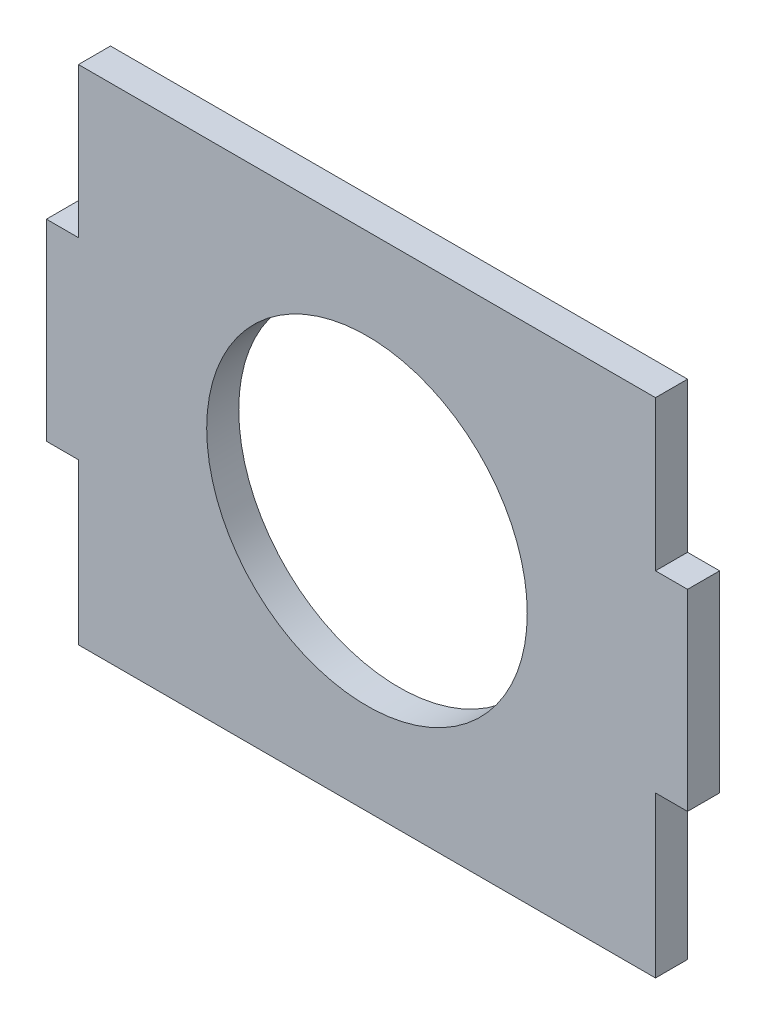
ISO-10303-21;
HEADER;
FILE_DESCRIPTION(('STEP AP214'),'2;1');
FILE_NAME('part.step','',(''),(''),'','','');
FILE_SCHEMA(('AUTOMOTIVE_DESIGN { 1 0 10303 214 1 1 1 1 }'));
ENDSEC;
DATA;
#1=APPLICATION_CONTEXT('core data for automotive mechanical design processes');
#2=APPLICATION_PROTOCOL_DEFINITION('international standard','automotive_design',2000,#1);
#3=PRODUCT_CONTEXT('',#1,'mechanical');
#4=PRODUCT('Part','Part','',(#3));
#5=PRODUCT_RELATED_PRODUCT_CATEGORY('part','',(#4));
#6=PRODUCT_DEFINITION_FORMATION('','',#4);
#7=PRODUCT_DEFINITION_CONTEXT('part definition',#1,'design');
#8=PRODUCT_DEFINITION('design','',#6,#7);
#9=PRODUCT_DEFINITION_SHAPE('','',#8);
#10=(LENGTH_UNIT() NAMED_UNIT(*) SI_UNIT(.MILLI.,.METRE.));
#11=(NAMED_UNIT(*) PLANE_ANGLE_UNIT() SI_UNIT($,.RADIAN.));
#12=(NAMED_UNIT(*) SI_UNIT($,.STERADIAN.) SOLID_ANGLE_UNIT());
#13=UNCERTAINTY_MEASURE_WITH_UNIT(LENGTH_MEASURE(1.E-05),#10,'distance_accuracy_value','');
#14=(GEOMETRIC_REPRESENTATION_CONTEXT(3) GLOBAL_UNCERTAINTY_ASSIGNED_CONTEXT((#13)) GLOBAL_UNIT_ASSIGNED_CONTEXT((#10,
#11,#12)) REPRESENTATION_CONTEXT('',''));
#15=CARTESIAN_POINT('',(0.,0.,0.));
#16=DIRECTION('',(0.,0.,1.));
#17=DIRECTION('',(1.,0.,0.));
#18=AXIS2_PLACEMENT_3D('',#15,#16,#17);
#19=CARTESIAN_POINT('',(0.,0.,3.175));
#20=DIRECTION('',(0.,0.,1.));
#21=DIRECTION('',(1.,0.,0.));
#22=AXIS2_PLACEMENT_3D('',#19,#20,#21);
#23=PLANE('',#22);
#24=DIRECTION('',(0.,-1.,0.));
#25=VECTOR('',#24,1.);
#26=CARTESIAN_POINT('',(-60.325,41.275,3.175));
#27=LINE('',#26,#25);
#28=CARTESIAN_POINT('',(-60.325,56.1264598778702,3.175));
#29=VERTEX_POINT('',#28);
#30=CARTESIAN_POINT('',(-60.325,41.275,3.175));
#31=VERTEX_POINT('',#30);
#32=EDGE_CURVE('E177',#29,#31,#27,.T.);
#33=ORIENTED_EDGE('',*,*,#32,.T.);
#34=DIRECTION('',(-1.,0.,0.));
#35=VECTOR('',#34,1.);
#36=CARTESIAN_POINT('',(-60.325,41.275,3.175));
#37=LINE('',#36,#35);
#38=CARTESIAN_POINT('',(-63.5,41.275,3.175));
#39=VERTEX_POINT('',#38);
#40=EDGE_CURVE('E105',#31,#39,#37,.T.);
#41=ORIENTED_EDGE('',*,*,#40,.T.);
#42=DIRECTION('',(0.,-1.,0.));
#43=VECTOR('',#42,1.);
#44=CARTESIAN_POINT('',(-63.5,41.275,3.175));
#45=LINE('',#44,#43);
#46=CARTESIAN_POINT('',(-63.5,22.225,3.175));
#47=VERTEX_POINT('',#46);
#48=EDGE_CURVE('E204',#39,#47,#45,.T.);
#49=ORIENTED_EDGE('',*,*,#48,.T.);
#50=DIRECTION('',(1.,0.,0.));
#51=VECTOR('',#50,1.);
#52=CARTESIAN_POINT('',(-63.5,22.225,3.175));
#53=LINE('',#52,#51);
#54=CARTESIAN_POINT('',(-60.325,22.225,3.175));
#55=VERTEX_POINT('',#54);
#56=EDGE_CURVE('E223',#47,#55,#53,.T.);
#57=ORIENTED_EDGE('',*,*,#56,.T.);
#58=DIRECTION('',(0.,-1.,0.));
#59=VECTOR('',#58,1.);
#60=CARTESIAN_POINT('',(-60.325,6.35000000000004,3.175));
#61=LINE('',#60,#59);
#62=CARTESIAN_POINT('',(-60.325,6.35000000000004,3.175));
#63=VERTEX_POINT('',#62);
#64=EDGE_CURVE('E220',#55,#63,#61,.T.);
#65=ORIENTED_EDGE('',*,*,#64,.T.);
#66=DIRECTION('',(1.,0.,0.));
#67=VECTOR('',#66,1.);
#68=CARTESIAN_POINT('',(-3.175,6.35000000000004,3.175));
#69=LINE('',#68,#67);
#70=CARTESIAN_POINT('',(-3.175,6.35000000000004,3.175));
#71=VERTEX_POINT('',#70);
#72=EDGE_CURVE('E222',#63,#71,#69,.T.);
#73=ORIENTED_EDGE('',*,*,#72,.T.);
#74=DIRECTION('',(0.,1.,0.));
#75=VECTOR('',#74,1.);
#76=CARTESIAN_POINT('',(-3.175,22.225,3.175));
#77=LINE('',#76,#75);
#78=CARTESIAN_POINT('',(-3.175,22.225,3.175));
#79=VERTEX_POINT('',#78);
#80=EDGE_CURVE('E225',#71,#79,#77,.T.);
#81=ORIENTED_EDGE('',*,*,#80,.T.);
#82=DIRECTION('',(1.,0.,0.));
#83=VECTOR('',#82,1.);
#84=CARTESIAN_POINT('',(-3.175,22.225,3.175));
#85=LINE('',#84,#83);
#86=CARTESIAN_POINT('',(0.,22.225,3.175));
#87=VERTEX_POINT('',#86);
#88=EDGE_CURVE('E231',#79,#87,#85,.T.);
#89=ORIENTED_EDGE('',*,*,#88,.T.);
#90=DIRECTION('',(0.,1.,0.));
#91=VECTOR('',#90,1.);
#92=CARTESIAN_POINT('',(0.,41.275,3.175));
#93=LINE('',#92,#91);
#94=CARTESIAN_POINT('',(0.,41.275,3.175));
#95=VERTEX_POINT('',#94);
#96=EDGE_CURVE('E136',#87,#95,#93,.T.);
#97=ORIENTED_EDGE('',*,*,#96,.T.);
#98=DIRECTION('',(-1.,0.,0.));
#99=VECTOR('',#98,1.);
#100=CARTESIAN_POINT('',(-3.175,41.275,3.175));
#101=LINE('',#100,#99);
#102=CARTESIAN_POINT('',(-3.175,41.275,3.175));
#103=VERTEX_POINT('',#102);
#104=EDGE_CURVE('E130',#95,#103,#101,.T.);
#105=ORIENTED_EDGE('',*,*,#104,.T.);
#106=DIRECTION('',(0.,1.,0.));
#107=VECTOR('',#106,1.);
#108=CARTESIAN_POINT('',(-3.175,41.275,3.175));
#109=LINE('',#108,#107);
#110=CARTESIAN_POINT('',(-3.175,56.1264598778702,3.175));
#111=VERTEX_POINT('',#110);
#112=EDGE_CURVE('E134',#103,#111,#109,.T.);
#113=ORIENTED_EDGE('',*,*,#112,.T.);
#114=DIRECTION('',(-1.,0.,0.));
#115=VECTOR('',#114,1.);
#116=CARTESIAN_POINT('',(-3.175,56.1264598778702,3.175));
#117=LINE('',#116,#115);
#118=EDGE_CURVE('E50',#111,#29,#117,.T.);
#119=ORIENTED_EDGE('',*,*,#118,.T.);
#120=EDGE_LOOP('',(#33,#41,#49,#57,#65,#73,#81,#89,#97,#105,#113,#119));
#121=FACE_BOUND('',#120,.T.);
#122=CARTESIAN_POINT('',(-31.75,31.27375,3.175));
#123=DIRECTION('',(0.,0.,1.));
#124=DIRECTION('',(1.,0.,0.));
#125=AXIS2_PLACEMENT_3D('',#122,#123,#124);
#126=CIRCLE('',#125,15.875);
#127=CARTESIAN_POINT('',(-15.875,31.27375,3.175));
#128=VERTEX_POINT('',#127);
#129=EDGE_CURVE('E158',#128,#128,#126,.T.);
#130=ORIENTED_EDGE('',*,*,#129,.F.);
#131=EDGE_LOOP('',(#130));
#132=FACE_BOUND('',#131,.T.);
#133=ADVANCED_FACE('F33',(#121,#132),#23,.T.);
#134=CARTESIAN_POINT('',(0.,0.,0.));
#135=DIRECTION('',(0.,0.,1.));
#136=DIRECTION('',(1.,0.,0.));
#137=AXIS2_PLACEMENT_3D('',#134,#135,#136);
#138=PLANE('',#137);
#139=DIRECTION('',(0.,-1.,0.));
#140=VECTOR('',#139,1.);
#141=CARTESIAN_POINT('',(-60.325,41.275,0.));
#142=LINE('',#141,#140);
#143=CARTESIAN_POINT('',(-60.325,56.1264598778702,0.));
#144=VERTEX_POINT('',#143);
#145=CARTESIAN_POINT('',(-60.325,41.275,0.));
#146=VERTEX_POINT('',#145);
#147=EDGE_CURVE('E154',#144,#146,#142,.T.);
#148=ORIENTED_EDGE('',*,*,#147,.F.);
#149=DIRECTION('',(-1.,0.,0.));
#150=VECTOR('',#149,1.);
#151=CARTESIAN_POINT('',(-3.175,56.1264598778702,0.));
#152=LINE('',#151,#150);
#153=CARTESIAN_POINT('',(-3.175,56.1264598778702,0.));
#154=VERTEX_POINT('',#153);
#155=EDGE_CURVE('E97',#154,#144,#152,.T.);
#156=ORIENTED_EDGE('',*,*,#155,.F.);
#157=DIRECTION('',(0.,1.,0.));
#158=VECTOR('',#157,1.);
#159=CARTESIAN_POINT('',(-3.175,41.275,0.));
#160=LINE('',#159,#158);
#161=CARTESIAN_POINT('',(-3.175,41.275,0.));
#162=VERTEX_POINT('',#161);
#163=EDGE_CURVE('E91',#162,#154,#160,.T.);
#164=ORIENTED_EDGE('',*,*,#163,.F.);
#165=DIRECTION('',(-1.,0.,0.));
#166=VECTOR('',#165,1.);
#167=CARTESIAN_POINT('',(-3.175,41.275,0.));
#168=LINE('',#167,#166);
#169=CARTESIAN_POINT('',(0.,41.275,0.));
#170=VERTEX_POINT('',#169);
#171=EDGE_CURVE('E144',#170,#162,#168,.T.);
#172=ORIENTED_EDGE('',*,*,#171,.F.);
#173=DIRECTION('',(0.,1.,0.));
#174=VECTOR('',#173,1.);
#175=CARTESIAN_POINT('',(0.,41.275,0.));
#176=LINE('',#175,#174);
#177=CARTESIAN_POINT('',(0.,22.225,0.));
#178=VERTEX_POINT('',#177);
#179=EDGE_CURVE('E172',#178,#170,#176,.T.);
#180=ORIENTED_EDGE('',*,*,#179,.F.);
#181=DIRECTION('',(1.,0.,0.));
#182=VECTOR('',#181,1.);
#183=CARTESIAN_POINT('',(-3.175,22.225,0.));
#184=LINE('',#183,#182);
#185=CARTESIAN_POINT('',(-3.175,22.225,0.));
#186=VERTEX_POINT('',#185);
#187=EDGE_CURVE('E170',#186,#178,#184,.T.);
#188=ORIENTED_EDGE('',*,*,#187,.F.);
#189=DIRECTION('',(0.,1.,0.));
#190=VECTOR('',#189,1.);
#191=CARTESIAN_POINT('',(-3.175,22.225,0.));
#192=LINE('',#191,#190);
#193=CARTESIAN_POINT('',(-3.175,6.35000000000004,0.));
#194=VERTEX_POINT('',#193);
#195=EDGE_CURVE('E168',#194,#186,#192,.T.);
#196=ORIENTED_EDGE('',*,*,#195,.F.);
#197=DIRECTION('',(1.,0.,0.));
#198=VECTOR('',#197,1.);
#199=CARTESIAN_POINT('',(-3.175,6.35000000000004,0.));
#200=LINE('',#199,#198);
#201=CARTESIAN_POINT('',(-60.325,6.35000000000004,0.));
#202=VERTEX_POINT('',#201);
#203=EDGE_CURVE('E166',#202,#194,#200,.T.);
#204=ORIENTED_EDGE('',*,*,#203,.F.);
#205=DIRECTION('',(0.,-1.,0.));
#206=VECTOR('',#205,1.);
#207=CARTESIAN_POINT('',(-60.325,6.35000000000004,0.));
#208=LINE('',#207,#206);
#209=CARTESIAN_POINT('',(-60.325,22.225,0.));
#210=VERTEX_POINT('',#209);
#211=EDGE_CURVE('E164',#210,#202,#208,.T.);
#212=ORIENTED_EDGE('',*,*,#211,.F.);
#213=DIRECTION('',(1.,0.,0.));
#214=VECTOR('',#213,1.);
#215=CARTESIAN_POINT('',(-63.5,22.225,0.));
#216=LINE('',#215,#214);
#217=CARTESIAN_POINT('',(-63.5,22.225,0.));
#218=VERTEX_POINT('',#217);
#219=EDGE_CURVE('E162',#218,#210,#216,.T.);
#220=ORIENTED_EDGE('',*,*,#219,.F.);
#221=DIRECTION('',(0.,-1.,0.));
#222=VECTOR('',#221,1.);
#223=CARTESIAN_POINT('',(-63.5,41.275,0.));
#224=LINE('',#223,#222);
#225=CARTESIAN_POINT('',(-63.5,41.275,0.));
#226=VERTEX_POINT('',#225);
#227=EDGE_CURVE('E160',#226,#218,#224,.T.);
#228=ORIENTED_EDGE('',*,*,#227,.F.);
#229=DIRECTION('',(-1.,0.,0.));
#230=VECTOR('',#229,1.);
#231=CARTESIAN_POINT('',(-60.325,41.275,0.));
#232=LINE('',#231,#230);
#233=EDGE_CURVE('E157',#146,#226,#232,.T.);
#234=ORIENTED_EDGE('',*,*,#233,.F.);
#235=EDGE_LOOP('',(#148,#156,#164,#172,#180,#188,#196,#204,#212,#220,#228,#234));
#236=FACE_BOUND('',#235,.T.);
#237=CARTESIAN_POINT('',(-31.75,31.27375,0.));
#238=DIRECTION('',(0.,0.,1.));
#239=DIRECTION('',(1.,0.,0.));
#240=AXIS2_PLACEMENT_3D('',#237,#238,#239);
#241=CIRCLE('',#240,15.875);
#242=CARTESIAN_POINT('',(-15.875,31.27375,0.));
#243=VERTEX_POINT('',#242);
#244=EDGE_CURVE('E378',#243,#243,#241,.T.);
#245=ORIENTED_EDGE('',*,*,#244,.T.);
#246=EDGE_LOOP('',(#245));
#247=FACE_BOUND('',#246,.T.);
#248=ADVANCED_FACE('F208',(#236,#247),#138,.F.);
#249=CARTESIAN_POINT('',(-60.325,41.275,3.175));
#250=DIRECTION('',(1.,0.,0.));
#251=DIRECTION('',(0.,0.,-1.));
#252=AXIS2_PLACEMENT_3D('',#249,#250,#251);
#253=PLANE('',#252);
#254=ORIENTED_EDGE('',*,*,#147,.T.);
#255=DIRECTION('',(0.,0.,-1.));
#256=VECTOR('',#255,1.);
#257=CARTESIAN_POINT('',(-60.325,41.275,3.175));
#258=LINE('',#257,#256);
#259=EDGE_CURVE('E11',#31,#146,#258,.T.);
#260=ORIENTED_EDGE('',*,*,#259,.F.);
#261=ORIENTED_EDGE('',*,*,#32,.F.);
#262=DIRECTION('',(0.,0.,-1.));
#263=VECTOR('',#262,1.);
#264=CARTESIAN_POINT('',(-60.325,56.1264598778702,3.175));
#265=LINE('',#264,#263);
#266=EDGE_CURVE('E150',#29,#144,#265,.T.);
#267=ORIENTED_EDGE('',*,*,#266,.T.);
#268=EDGE_LOOP('',(#254,#260,#261,#267));
#269=FACE_BOUND('',#268,.T.);
#270=ADVANCED_FACE('F35',(#269),#253,.F.);
#271=CARTESIAN_POINT('',(-60.325,41.275,3.175));
#272=DIRECTION('',(0.,-1.,0.));
#273=DIRECTION('',(0.,0.,-1.));
#274=AXIS2_PLACEMENT_3D('',#271,#272,#273);
#275=PLANE('',#274);
#276=ORIENTED_EDGE('',*,*,#233,.T.);
#277=DIRECTION('',(0.,0.,-1.));
#278=VECTOR('',#277,1.);
#279=CARTESIAN_POINT('',(-63.5,41.275,3.175));
#280=LINE('',#279,#278);
#281=EDGE_CURVE('E42',#39,#226,#280,.T.);
#282=ORIENTED_EDGE('',*,*,#281,.F.);
#283=ORIENTED_EDGE('',*,*,#40,.F.);
#284=ORIENTED_EDGE('',*,*,#259,.T.);
#285=EDGE_LOOP('',(#276,#282,#283,#284));
#286=FACE_BOUND('',#285,.T.);
#287=ADVANCED_FACE('F265',(#286),#275,.F.);
#288=CARTESIAN_POINT('',(-63.5,41.275,3.175));
#289=DIRECTION('',(1.,0.,0.));
#290=DIRECTION('',(0.,0.,-1.));
#291=AXIS2_PLACEMENT_3D('',#288,#289,#290);
#292=PLANE('',#291);
#293=ORIENTED_EDGE('',*,*,#227,.T.);
#294=DIRECTION('',(0.,0.,-1.));
#295=VECTOR('',#294,1.);
#296=CARTESIAN_POINT('',(-63.5,22.225,3.175));
#297=LINE('',#296,#295);
#298=EDGE_CURVE('E196',#47,#218,#297,.T.);
#299=ORIENTED_EDGE('',*,*,#298,.F.);
#300=ORIENTED_EDGE('',*,*,#48,.F.);
#301=ORIENTED_EDGE('',*,*,#281,.T.);
#302=EDGE_LOOP('',(#293,#299,#300,#301));
#303=FACE_BOUND('',#302,.T.);
#304=ADVANCED_FACE('F202',(#303),#292,.F.);
#305=CARTESIAN_POINT('',(-63.5,22.225,3.175));
#306=DIRECTION('',(0.,1.,0.));
#307=DIRECTION('',(0.,0.,1.));
#308=AXIS2_PLACEMENT_3D('',#305,#306,#307);
#309=PLANE('',#308);
#310=ORIENTED_EDGE('',*,*,#219,.T.);
#311=DIRECTION('',(0.,0.,-1.));
#312=VECTOR('',#311,1.);
#313=CARTESIAN_POINT('',(-60.325,22.225,3.175));
#314=LINE('',#313,#312);
#315=EDGE_CURVE('E193',#55,#210,#314,.T.);
#316=ORIENTED_EDGE('',*,*,#315,.F.);
#317=ORIENTED_EDGE('',*,*,#56,.F.);
#318=ORIENTED_EDGE('',*,*,#298,.T.);
#319=EDGE_LOOP('',(#310,#316,#317,#318));
#320=FACE_BOUND('',#319,.T.);
#321=ADVANCED_FACE('F214',(#320),#309,.F.);
#322=CARTESIAN_POINT('',(-60.325,6.35000000000004,3.175));
#323=DIRECTION('',(1.,0.,0.));
#324=DIRECTION('',(0.,0.,-1.));
#325=AXIS2_PLACEMENT_3D('',#322,#323,#324);
#326=PLANE('',#325);
#327=ORIENTED_EDGE('',*,*,#211,.T.);
#328=DIRECTION('',(0.,0.,-1.));
#329=VECTOR('',#328,1.);
#330=CARTESIAN_POINT('',(-60.325,6.35000000000004,3.175));
#331=LINE('',#330,#329);
#332=EDGE_CURVE('E190',#63,#202,#331,.T.);
#333=ORIENTED_EDGE('',*,*,#332,.F.);
#334=ORIENTED_EDGE('',*,*,#64,.F.);
#335=ORIENTED_EDGE('',*,*,#315,.T.);
#336=EDGE_LOOP('',(#327,#333,#334,#335));
#337=FACE_BOUND('',#336,.T.);
#338=ADVANCED_FACE('F218',(#337),#326,.F.);
#339=CARTESIAN_POINT('',(-3.175,6.35000000000004,3.175));
#340=DIRECTION('',(0.,1.,0.));
#341=DIRECTION('',(0.,0.,1.));
#342=AXIS2_PLACEMENT_3D('',#339,#340,#341);
#343=PLANE('',#342);
#344=ORIENTED_EDGE('',*,*,#203,.T.);
#345=DIRECTION('',(0.,0.,-1.));
#346=VECTOR('',#345,1.);
#347=CARTESIAN_POINT('',(-3.175,6.35000000000004,3.175));
#348=LINE('',#347,#346);
#349=EDGE_CURVE('E187',#71,#194,#348,.T.);
#350=ORIENTED_EDGE('',*,*,#349,.F.);
#351=ORIENTED_EDGE('',*,*,#72,.F.);
#352=ORIENTED_EDGE('',*,*,#332,.T.);
#353=EDGE_LOOP('',(#344,#350,#351,#352));
#354=FACE_BOUND('',#353,.T.);
#355=ADVANCED_FACE('F278',(#354),#343,.F.);
#356=CARTESIAN_POINT('',(-3.175,22.225,3.175));
#357=DIRECTION('',(-1.,0.,0.));
#358=DIRECTION('',(0.,0.,1.));
#359=AXIS2_PLACEMENT_3D('',#356,#357,#358);
#360=PLANE('',#359);
#361=ORIENTED_EDGE('',*,*,#195,.T.);
#362=DIRECTION('',(0.,0.,-1.));
#363=VECTOR('',#362,1.);
#364=CARTESIAN_POINT('',(-3.175,22.225,3.175));
#365=LINE('',#364,#363);
#366=EDGE_CURVE('E184',#79,#186,#365,.T.);
#367=ORIENTED_EDGE('',*,*,#366,.F.);
#368=ORIENTED_EDGE('',*,*,#80,.F.);
#369=ORIENTED_EDGE('',*,*,#349,.T.);
#370=EDGE_LOOP('',(#361,#367,#368,#369));
#371=FACE_BOUND('',#370,.T.);
#372=ADVANCED_FACE('F281',(#371),#360,.F.);
#373=CARTESIAN_POINT('',(-3.175,22.225,3.175));
#374=DIRECTION('',(0.,1.,0.));
#375=DIRECTION('',(0.,0.,1.));
#376=AXIS2_PLACEMENT_3D('',#373,#374,#375);
#377=PLANE('',#376);
#378=ORIENTED_EDGE('',*,*,#187,.T.);
#379=DIRECTION('',(0.,0.,-1.));
#380=VECTOR('',#379,1.);
#381=CARTESIAN_POINT('',(0.,22.225,3.175));
#382=LINE('',#381,#380);
#383=EDGE_CURVE('E181',#87,#178,#382,.T.);
#384=ORIENTED_EDGE('',*,*,#383,.F.);
#385=ORIENTED_EDGE('',*,*,#88,.F.);
#386=ORIENTED_EDGE('',*,*,#366,.T.);
#387=EDGE_LOOP('',(#378,#384,#385,#386));
#388=FACE_BOUND('',#387,.T.);
#389=ADVANCED_FACE('F237',(#388),#377,.F.);
#390=CARTESIAN_POINT('',(0.,41.275,3.175));
#391=DIRECTION('',(-1.,0.,0.));
#392=DIRECTION('',(0.,0.,1.));
#393=AXIS2_PLACEMENT_3D('',#390,#391,#392);
#394=PLANE('',#393);
#395=ORIENTED_EDGE('',*,*,#179,.T.);
#396=DIRECTION('',(0.,0.,-1.));
#397=VECTOR('',#396,1.);
#398=CARTESIAN_POINT('',(0.,41.275,3.175));
#399=LINE('',#398,#397);
#400=EDGE_CURVE('E145',#95,#170,#399,.T.);
#401=ORIENTED_EDGE('',*,*,#400,.F.);
#402=ORIENTED_EDGE('',*,*,#96,.F.);
#403=ORIENTED_EDGE('',*,*,#383,.T.);
#404=EDGE_LOOP('',(#395,#401,#402,#403));
#405=FACE_BOUND('',#404,.T.);
#406=ADVANCED_FACE('F241',(#405),#394,.F.);
#407=CARTESIAN_POINT('',(-3.175,41.275,3.175));
#408=DIRECTION('',(0.,-1.,0.));
#409=DIRECTION('',(0.,0.,-1.));
#410=AXIS2_PLACEMENT_3D('',#407,#408,#409);
#411=PLANE('',#410);
#412=ORIENTED_EDGE('',*,*,#171,.T.);
#413=DIRECTION('',(0.,0.,-1.));
#414=VECTOR('',#413,1.);
#415=CARTESIAN_POINT('',(-3.175,41.275,3.175));
#416=LINE('',#415,#414);
#417=EDGE_CURVE('E141',#103,#162,#416,.T.);
#418=ORIENTED_EDGE('',*,*,#417,.F.);
#419=ORIENTED_EDGE('',*,*,#104,.F.);
#420=ORIENTED_EDGE('',*,*,#400,.T.);
#421=EDGE_LOOP('',(#412,#418,#419,#420));
#422=FACE_BOUND('',#421,.T.);
#423=ADVANCED_FACE('F142',(#422),#411,.F.);
#424=CARTESIAN_POINT('',(-3.175,41.275,3.175));
#425=DIRECTION('',(-1.,0.,0.));
#426=DIRECTION('',(0.,0.,1.));
#427=AXIS2_PLACEMENT_3D('',#424,#425,#426);
#428=PLANE('',#427);
#429=ORIENTED_EDGE('',*,*,#163,.T.);
#430=DIRECTION('',(0.,0.,-1.));
#431=VECTOR('',#430,1.);
#432=CARTESIAN_POINT('',(-3.175,56.1264598778702,3.175));
#433=LINE('',#432,#431);
#434=EDGE_CURVE('E146',#111,#154,#433,.T.);
#435=ORIENTED_EDGE('',*,*,#434,.F.);
#436=ORIENTED_EDGE('',*,*,#112,.F.);
#437=ORIENTED_EDGE('',*,*,#417,.T.);
#438=EDGE_LOOP('',(#429,#435,#436,#437));
#439=FACE_BOUND('',#438,.T.);
#440=ADVANCED_FACE('F148',(#439),#428,.F.);
#441=CARTESIAN_POINT('',(-3.175,56.1264598778702,3.175));
#442=DIRECTION('',(0.,-1.,0.));
#443=DIRECTION('',(0.,0.,-1.));
#444=AXIS2_PLACEMENT_3D('',#441,#442,#443);
#445=PLANE('',#444);
#446=ORIENTED_EDGE('',*,*,#155,.T.);
#447=ORIENTED_EDGE('',*,*,#266,.F.);
#448=ORIENTED_EDGE('',*,*,#118,.F.);
#449=ORIENTED_EDGE('',*,*,#434,.T.);
#450=EDGE_LOOP('',(#446,#447,#448,#449));
#451=FACE_BOUND('',#450,.T.);
#452=ADVANCED_FACE('F245',(#451),#445,.F.);
#453=CARTESIAN_POINT('',(-31.75,31.27375,3.175));
#454=DIRECTION('',(0.,0.,-1.));
#455=DIRECTION('',(-1.,0.,0.));
#456=AXIS2_PLACEMENT_3D('',#453,#454,#455);
#457=CYLINDRICAL_SURFACE('',#456,15.875);
#458=ORIENTED_EDGE('',*,*,#129,.T.);
#459=EDGE_LOOP('',(#458));
#460=FACE_BOUND('',#459,.T.);
#461=ORIENTED_EDGE('',*,*,#244,.F.);
#462=EDGE_LOOP('',(#461));
#463=FACE_BOUND('',#462,.T.);
#464=ADVANCED_FACE('F247',(#460,#463),#457,.F.);
#465=CLOSED_SHELL('',(#133,#248,#270,#287,#304,#321,#338,#355,#372,#389,#406,#423,#440,#452,#464));
#466=MANIFOLD_SOLID_BREP('B2',#465);
#467=ADVANCED_BREP_SHAPE_REPRESENTATION('',(#18,#466),#14);
#468=SHAPE_DEFINITION_REPRESENTATION(#9,#467);
ENDSEC;
END-ISO-10303-21;
